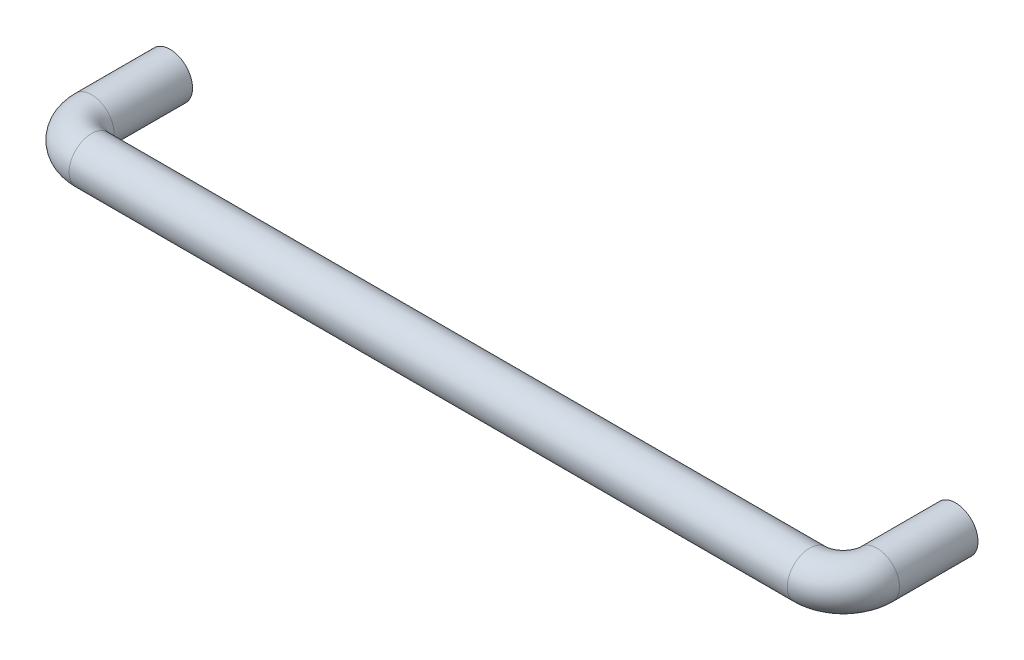
ISO-10303-21;
HEADER;
FILE_DESCRIPTION(('STEP AP214'),'2;1');
FILE_NAME('part.step','',(''),(''),'','','');
FILE_SCHEMA(('AUTOMOTIVE_DESIGN { 1 0 10303 214 1 1 1 1 }'));
ENDSEC;
DATA;
#1=APPLICATION_CONTEXT('core data for automotive mechanical design processes');
#2=APPLICATION_PROTOCOL_DEFINITION('international standard','automotive_design',2000,#1);
#3=PRODUCT_CONTEXT('',#1,'mechanical');
#4=PRODUCT('Part','Part','',(#3));
#5=PRODUCT_RELATED_PRODUCT_CATEGORY('part','',(#4));
#6=PRODUCT_DEFINITION_FORMATION('','',#4);
#7=PRODUCT_DEFINITION_CONTEXT('part definition',#1,'design');
#8=PRODUCT_DEFINITION('design','',#6,#7);
#9=PRODUCT_DEFINITION_SHAPE('','',#8);
#10=(LENGTH_UNIT() NAMED_UNIT(*) SI_UNIT(.MILLI.,.METRE.));
#11=(NAMED_UNIT(*) PLANE_ANGLE_UNIT() SI_UNIT($,.RADIAN.));
#12=(NAMED_UNIT(*) SI_UNIT($,.STERADIAN.) SOLID_ANGLE_UNIT());
#13=UNCERTAINTY_MEASURE_WITH_UNIT(LENGTH_MEASURE(1.E-05),#10,'distance_accuracy_value','');
#14=(GEOMETRIC_REPRESENTATION_CONTEXT(3) GLOBAL_UNCERTAINTY_ASSIGNED_CONTEXT((#13)) GLOBAL_UNIT_ASSIGNED_CONTEXT((#10,
#11,#12)) REPRESENTATION_CONTEXT('',''));
#15=CARTESIAN_POINT('',(0.,0.,0.));
#16=DIRECTION('',(0.,0.,1.));
#17=DIRECTION('',(1.,0.,0.));
#18=AXIS2_PLACEMENT_3D('',#15,#16,#17);
#19=CARTESIAN_POINT('',(0.,0.,0.));
#20=DIRECTION('',(0.,0.,1.));
#21=DIRECTION('',(1.,0.,0.));
#22=AXIS2_PLACEMENT_3D('',#19,#20,#21);
#23=PLANE('',#22);
#24=CARTESIAN_POINT('',(0.,0.,0.));
#25=DIRECTION('',(0.,0.,1.));
#26=DIRECTION('',(1.,0.,0.));
#27=AXIS2_PLACEMENT_3D('',#24,#25,#26);
#28=CIRCLE('',#27,1.);
#29=CARTESIAN_POINT('',(1.,0.,0.));
#30=VERTEX_POINT('',#29);
#31=EDGE_CURVE('E45',#30,#30,#28,.T.);
#32=ORIENTED_EDGE('',*,*,#31,.F.);
#33=EDGE_LOOP('',(#32));
#34=FACE_BOUND('',#33,.T.);
#35=ADVANCED_FACE('F33',(#34),#23,.F.);
#36=CARTESIAN_POINT('',(-35.,0.,0.));
#37=DIRECTION('',(0.,0.,-1.));
#38=DIRECTION('',(-1.,0.,0.));
#39=AXIS2_PLACEMENT_3D('',#36,#37,#38);
#40=PLANE('',#39);
#41=CARTESIAN_POINT('',(-35.,0.,0.));
#42=DIRECTION('',(0.,0.,-1.));
#43=DIRECTION('',(-1.,0.,0.));
#44=AXIS2_PLACEMENT_3D('',#41,#42,#43);
#45=CIRCLE('',#44,1.);
#46=CARTESIAN_POINT('',(-36.,0.,0.));
#47=VERTEX_POINT('',#46);
#48=EDGE_CURVE('E11',#47,#47,#45,.T.);
#49=ORIENTED_EDGE('',*,*,#48,.T.);
#50=EDGE_LOOP('',(#49));
#51=FACE_BOUND('',#50,.T.);
#52=ADVANCED_FACE('F48',(#51),#40,.T.);
#53=CARTESIAN_POINT('',(0.,0.,0.));
#54=DIRECTION('',(0.,0.,1.));
#55=DIRECTION('',(1.,0.,0.));
#56=AXIS2_PLACEMENT_3D('',#53,#54,#55);
#57=CYLINDRICAL_SURFACE('',#56,1.);
#58=CARTESIAN_POINT('',(0.,0.,3.5));
#59=DIRECTION('',(0.,0.,1.));
#60=DIRECTION('',(1.,0.,0.));
#61=AXIS2_PLACEMENT_3D('',#58,#59,#60);
#62=CIRCLE('',#61,1.);
#63=CARTESIAN_POINT('',(0.999999999999999,0.,3.5));
#64=VERTEX_POINT('',#63);
#65=EDGE_CURVE('E65',#64,#64,#62,.T.);
#66=ORIENTED_EDGE('',*,*,#65,.F.);
#67=EDGE_LOOP('',(#66));
#68=FACE_BOUND('',#67,.T.);
#69=ORIENTED_EDGE('',*,*,#31,.T.);
#70=EDGE_LOOP('',(#69));
#71=FACE_BOUND('',#70,.T.);
#72=ADVANCED_FACE('F69',(#68,#71),#57,.T.);
#73=CARTESIAN_POINT('',(-1.5,0.,3.5));
#74=DIRECTION('',(0.,-1.,0.));
#75=DIRECTION('',(0.,0.,-1.));
#76=AXIS2_PLACEMENT_3D('',#73,#74,#75);
#77=TOROIDAL_SURFACE('',#76,1.5,1.);
#78=CARTESIAN_POINT('',(-1.5,0.,5.));
#79=DIRECTION('',(-1.,0.,0.));
#80=DIRECTION('',(0.,0.,1.));
#81=AXIS2_PLACEMENT_3D('',#78,#79,#80);
#82=CIRCLE('',#81,1.);
#83=CARTESIAN_POINT('',(-1.5,0.,6.));
#84=VERTEX_POINT('',#83);
#85=EDGE_CURVE('E60',#84,#84,#82,.T.);
#86=CARTESIAN_POINT('',(-1.5,0.,3.5));
#87=DIRECTION('',(0.,-1.,0.));
#88=DIRECTION('',(0.,0.,-1.));
#89=AXIS2_PLACEMENT_3D('',#86,#87,#88);
#90=CIRCLE('',#89,2.5);
#91=EDGE_CURVE('',#64,#84,#90,.T.);
#92=ORIENTED_EDGE('',*,*,#65,.T.);
#93=ORIENTED_EDGE('',*,*,#85,.F.);
#94=ORIENTED_EDGE('',*,*,#91,.T.);
#95=ORIENTED_EDGE('',*,*,#91,.F.);
#96=EDGE_LOOP('',(#92,#94,#93,#95));
#97=FACE_BOUND('',#96,.T.);
#98=ADVANCED_FACE('F71',(#97),#77,.T.);
#99=CARTESIAN_POINT('',(-1.5,0.,5.));
#100=DIRECTION('',(-1.,0.,0.));
#101=DIRECTION('',(0.,0.,1.));
#102=AXIS2_PLACEMENT_3D('',#99,#100,#101);
#103=CYLINDRICAL_SURFACE('',#102,1.);
#104=CARTESIAN_POINT('',(-33.5,0.,5.));
#105=DIRECTION('',(-1.,0.,0.));
#106=DIRECTION('',(0.,0.,1.));
#107=AXIS2_PLACEMENT_3D('',#104,#105,#106);
#108=CIRCLE('',#107,1.);
#109=CARTESIAN_POINT('',(-33.5,0.,6.));
#110=VERTEX_POINT('',#109);
#111=EDGE_CURVE('E58',#110,#110,#108,.T.);
#112=ORIENTED_EDGE('',*,*,#111,.F.);
#113=EDGE_LOOP('',(#112));
#114=FACE_BOUND('',#113,.T.);
#115=ORIENTED_EDGE('',*,*,#85,.T.);
#116=EDGE_LOOP('',(#115));
#117=FACE_BOUND('',#116,.T.);
#118=ADVANCED_FACE('F78',(#114,#117),#103,.T.);
#119=CARTESIAN_POINT('',(-33.5,0.,3.5));
#120=DIRECTION('',(0.,-1.,0.));
#121=DIRECTION('',(0.,0.,-1.));
#122=AXIS2_PLACEMENT_3D('',#119,#120,#121);
#123=TOROIDAL_SURFACE('',#122,1.5,1.);
#124=CARTESIAN_POINT('',(-35.,0.,3.5));
#125=DIRECTION('',(0.,0.,-1.));
#126=DIRECTION('',(-1.,0.,0.));
#127=AXIS2_PLACEMENT_3D('',#124,#125,#126);
#128=CIRCLE('',#127,1.);
#129=CARTESIAN_POINT('',(-36.,0.,3.5));
#130=VERTEX_POINT('',#129);
#131=EDGE_CURVE('E40',#130,#130,#128,.T.);
#132=CARTESIAN_POINT('',(-33.5,0.,3.5));
#133=DIRECTION('',(0.,-1.,0.));
#134=DIRECTION('',(0.,0.,-1.));
#135=AXIS2_PLACEMENT_3D('',#132,#133,#134);
#136=CIRCLE('',#135,2.5);
#137=EDGE_CURVE('',#110,#130,#136,.T.);
#138=ORIENTED_EDGE('',*,*,#111,.T.);
#139=ORIENTED_EDGE('',*,*,#131,.F.);
#140=ORIENTED_EDGE('',*,*,#137,.T.);
#141=ORIENTED_EDGE('',*,*,#137,.F.);
#142=EDGE_LOOP('',(#138,#140,#139,#141));
#143=FACE_BOUND('',#142,.T.);
#144=ADVANCED_FACE('F53',(#143),#123,.T.);
#145=CARTESIAN_POINT('',(-35.,0.,3.5));
#146=DIRECTION('',(0.,0.,-1.));
#147=DIRECTION('',(-1.,0.,0.));
#148=AXIS2_PLACEMENT_3D('',#145,#146,#147);
#149=CYLINDRICAL_SURFACE('',#148,1.);
#150=ORIENTED_EDGE('',*,*,#48,.F.);
#151=EDGE_LOOP('',(#150));
#152=FACE_BOUND('',#151,.T.);
#153=ORIENTED_EDGE('',*,*,#131,.T.);
#154=EDGE_LOOP('',(#153));
#155=FACE_BOUND('',#154,.T.);
#156=ADVANCED_FACE('F50',(#152,#155),#149,.T.);
#157=CLOSED_SHELL('',(#35,#52,#72,#98,#118,#144,#156));
#158=MANIFOLD_SOLID_BREP('B2',#157);
#159=ADVANCED_BREP_SHAPE_REPRESENTATION('',(#18,#158),#14);
#160=SHAPE_DEFINITION_REPRESENTATION(#9,#159);
ENDSEC;
END-ISO-10303-21;
